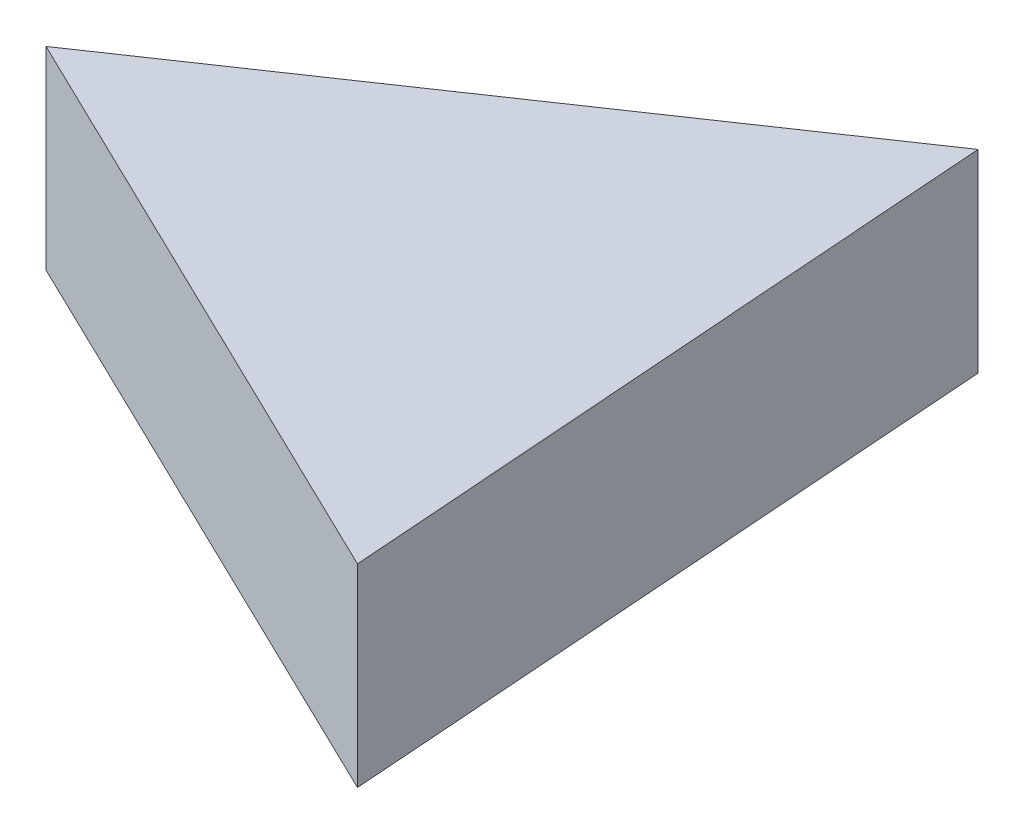
ISO-10303-21;
HEADER;
FILE_DESCRIPTION(('STEP AP214'),'2;1');
FILE_NAME('part.step','',(''),(''),'','','');
FILE_SCHEMA(('AUTOMOTIVE_DESIGN { 1 0 10303 214 1 1 1 1 }'));
ENDSEC;
DATA;
#1=APPLICATION_CONTEXT('core data for automotive mechanical design processes');
#2=APPLICATION_PROTOCOL_DEFINITION('international standard','automotive_design',2000,#1);
#3=PRODUCT_CONTEXT('',#1,'mechanical');
#4=PRODUCT('Part','Part','',(#3));
#5=PRODUCT_RELATED_PRODUCT_CATEGORY('part','',(#4));
#6=PRODUCT_DEFINITION_FORMATION('','',#4);
#7=PRODUCT_DEFINITION_CONTEXT('part definition',#1,'design');
#8=PRODUCT_DEFINITION('design','',#6,#7);
#9=PRODUCT_DEFINITION_SHAPE('','',#8);
#10=(LENGTH_UNIT() NAMED_UNIT(*) SI_UNIT(.MILLI.,.METRE.));
#11=(NAMED_UNIT(*) PLANE_ANGLE_UNIT() SI_UNIT($,.RADIAN.));
#12=(NAMED_UNIT(*) SI_UNIT($,.STERADIAN.) SOLID_ANGLE_UNIT());
#13=UNCERTAINTY_MEASURE_WITH_UNIT(LENGTH_MEASURE(1.E-05),#10,'distance_accuracy_value','');
#14=(GEOMETRIC_REPRESENTATION_CONTEXT(3) GLOBAL_UNCERTAINTY_ASSIGNED_CONTEXT((#13)) GLOBAL_UNIT_ASSIGNED_CONTEXT((#10,
#11,#12)) REPRESENTATION_CONTEXT('',''));
#15=CARTESIAN_POINT('',(0.,0.,0.));
#16=DIRECTION('',(0.,0.,1.));
#17=DIRECTION('',(1.,0.,0.));
#18=AXIS2_PLACEMENT_3D('',#15,#16,#17);
#19=CARTESIAN_POINT('',(-19.9472258325561,-10.,1.45195784546487));
#20=DIRECTION('',(-0.435809026844067,0.,0.900039161437561));
#21=DIRECTION('',(0.900039161437561,0.,0.435809026844067));
#22=AXIS2_PLACEMENT_3D('',#19,#20,#21);
#23=PLANE('',#22);
#24=DIRECTION('',(0.900039161437561,0.,0.435809026844067));
#25=VECTOR('',#24,1.);
#26=CARTESIAN_POINT('',(-19.9472258325561,0.,1.45195784546487));
#27=LINE('',#26,#25);
#28=CARTESIAN_POINT('',(-19.9472258325561,0.,1.45195784546487));
#29=VERTEX_POINT('',#28);
#30=CARTESIAN_POINT('',(11.2310452956747,0.,16.5488253832863));
#31=VERTEX_POINT('',#30);
#32=EDGE_CURVE('E84',#29,#31,#27,.T.);
#33=ORIENTED_EDGE('',*,*,#32,.F.);
#34=DIRECTION('',(0.,1.,0.));
#35=VECTOR('',#34,1.);
#36=CARTESIAN_POINT('',(-19.9472258325561,-10.,1.45195784546487));
#37=LINE('',#36,#35);
#38=CARTESIAN_POINT('',(-19.9472258325561,-10.,1.45195784546487));
#39=VERTEX_POINT('',#38);
#40=EDGE_CURVE('E11',#39,#29,#37,.T.);
#41=ORIENTED_EDGE('',*,*,#40,.F.);
#42=DIRECTION('',(0.900039161437561,0.,0.435809026844067));
#43=VECTOR('',#42,1.);
#44=CARTESIAN_POINT('',(-19.9472258325561,-10.,1.45195784546487));
#45=LINE('',#44,#43);
#46=CARTESIAN_POINT('',(11.2310452956747,-10.,16.5488253832863));
#47=VERTEX_POINT('',#46);
#48=EDGE_CURVE('E76',#39,#47,#45,.T.);
#49=ORIENTED_EDGE('',*,*,#48,.T.);
#50=DIRECTION('',(0.,1.,0.));
#51=VECTOR('',#50,1.);
#52=CARTESIAN_POINT('',(11.2310452956747,-10.,16.5488253832863));
#53=LINE('',#52,#51);
#54=EDGE_CURVE('E35',#47,#31,#53,.T.);
#55=ORIENTED_EDGE('',*,*,#54,.T.);
#56=EDGE_LOOP('',(#33,#41,#49,#55));
#57=FACE_BOUND('',#56,.T.);
#58=ADVANCED_FACE('F32',(#57),#23,.T.);
#59=CARTESIAN_POINT('',(8.71618053688135,-10.,-18.0007832287512));
#60=DIRECTION('',(-0.561552264783737,0.,-0.827441269164317));
#61=DIRECTION('',(-0.827441269164317,0.,0.561552264783737));
#62=AXIS2_PLACEMENT_3D('',#59,#60,#61);
#63=PLANE('',#62);
#64=DIRECTION('',(-0.827441269164317,0.,0.561552264783737));
#65=VECTOR('',#64,1.);
#66=CARTESIAN_POINT('',(8.71618053688135,0.,-18.0007832287512));
#67=LINE('',#66,#65);
#68=CARTESIAN_POINT('',(8.71618053688135,0.,-18.0007832287512));
#69=VERTEX_POINT('',#68);
#70=EDGE_CURVE('E78',#69,#29,#67,.T.);
#71=ORIENTED_EDGE('',*,*,#70,.F.);
#72=DIRECTION('',(0.,1.,0.));
#73=VECTOR('',#72,1.);
#74=CARTESIAN_POINT('',(8.71618053688135,-10.,-18.0007832287512));
#75=LINE('',#74,#73);
#76=CARTESIAN_POINT('',(8.71618053688135,-10.,-18.0007832287512));
#77=VERTEX_POINT('',#76);
#78=EDGE_CURVE('E41',#77,#69,#75,.T.);
#79=ORIENTED_EDGE('',*,*,#78,.F.);
#80=DIRECTION('',(-0.827441269164317,0.,0.561552264783737));
#81=VECTOR('',#80,1.);
#82=CARTESIAN_POINT('',(8.71618053688135,-10.,-18.0007832287512));
#83=LINE('',#82,#81);
#84=EDGE_CURVE('E73',#77,#39,#83,.T.);
#85=ORIENTED_EDGE('',*,*,#84,.T.);
#86=ORIENTED_EDGE('',*,*,#40,.T.);
#87=EDGE_LOOP('',(#71,#79,#85,#86));
#88=FACE_BOUND('',#87,.T.);
#89=ADVANCED_FACE('F88',(#88),#63,.T.);
#90=CARTESIAN_POINT('',(11.2310452956747,-10.,16.5488253832863));
#91=DIRECTION('',(0.997361291627805,0.,-0.0725978922732435));
#92=DIRECTION('',(-0.0725978922732435,0.,-0.997361291627805));
#93=AXIS2_PLACEMENT_3D('',#90,#91,#92);
#94=PLANE('',#93);
#95=DIRECTION('',(-0.0725978922732435,0.,-0.997361291627805));
#96=VECTOR('',#95,1.);
#97=CARTESIAN_POINT('',(11.2310452956747,0.,16.5488253832863));
#98=LINE('',#97,#96);
#99=EDGE_CURVE('E71',#31,#69,#98,.T.);
#100=ORIENTED_EDGE('',*,*,#99,.F.);
#101=ORIENTED_EDGE('',*,*,#54,.F.);
#102=DIRECTION('',(-0.0725978922732435,0.,-0.997361291627805));
#103=VECTOR('',#102,1.);
#104=CARTESIAN_POINT('',(11.2310452956747,-10.,16.5488253832863));
#105=LINE('',#104,#103);
#106=EDGE_CURVE('E69',#47,#77,#105,.T.);
#107=ORIENTED_EDGE('',*,*,#106,.T.);
#108=ORIENTED_EDGE('',*,*,#78,.T.);
#109=EDGE_LOOP('',(#100,#101,#107,#108));
#110=FACE_BOUND('',#109,.T.);
#111=ADVANCED_FACE('F68',(#110),#94,.T.);
#112=CARTESIAN_POINT('',(0.,-10.,0.));
#113=DIRECTION('',(0.,1.,0.));
#114=DIRECTION('',(0.,0.,1.));
#115=AXIS2_PLACEMENT_3D('',#112,#113,#114);
#116=PLANE('',#115);
#117=ORIENTED_EDGE('',*,*,#48,.F.);
#118=ORIENTED_EDGE('',*,*,#84,.F.);
#119=ORIENTED_EDGE('',*,*,#106,.F.);
#120=EDGE_LOOP('',(#117,#118,#119));
#121=FACE_BOUND('',#120,.T.);
#122=ADVANCED_FACE('F75',(#121),#116,.F.);
#123=CARTESIAN_POINT('',(0.,0.,0.));
#124=DIRECTION('',(0.,1.,0.));
#125=DIRECTION('',(0.,0.,1.));
#126=AXIS2_PLACEMENT_3D('',#123,#124,#125);
#127=PLANE('',#126);
#128=ORIENTED_EDGE('',*,*,#32,.T.);
#129=ORIENTED_EDGE('',*,*,#99,.T.);
#130=ORIENTED_EDGE('',*,*,#70,.T.);
#131=EDGE_LOOP('',(#128,#129,#130));
#132=FACE_BOUND('',#131,.T.);
#133=ADVANCED_FACE('F87',(#132),#127,.T.);
#134=CLOSED_SHELL('',(#58,#89,#111,#122,#133));
#135=MANIFOLD_SOLID_BREP('B2',#134);
#136=ADVANCED_BREP_SHAPE_REPRESENTATION('',(#18,#135),#14);
#137=SHAPE_DEFINITION_REPRESENTATION(#9,#136);
ENDSEC;
END-ISO-10303-21;
